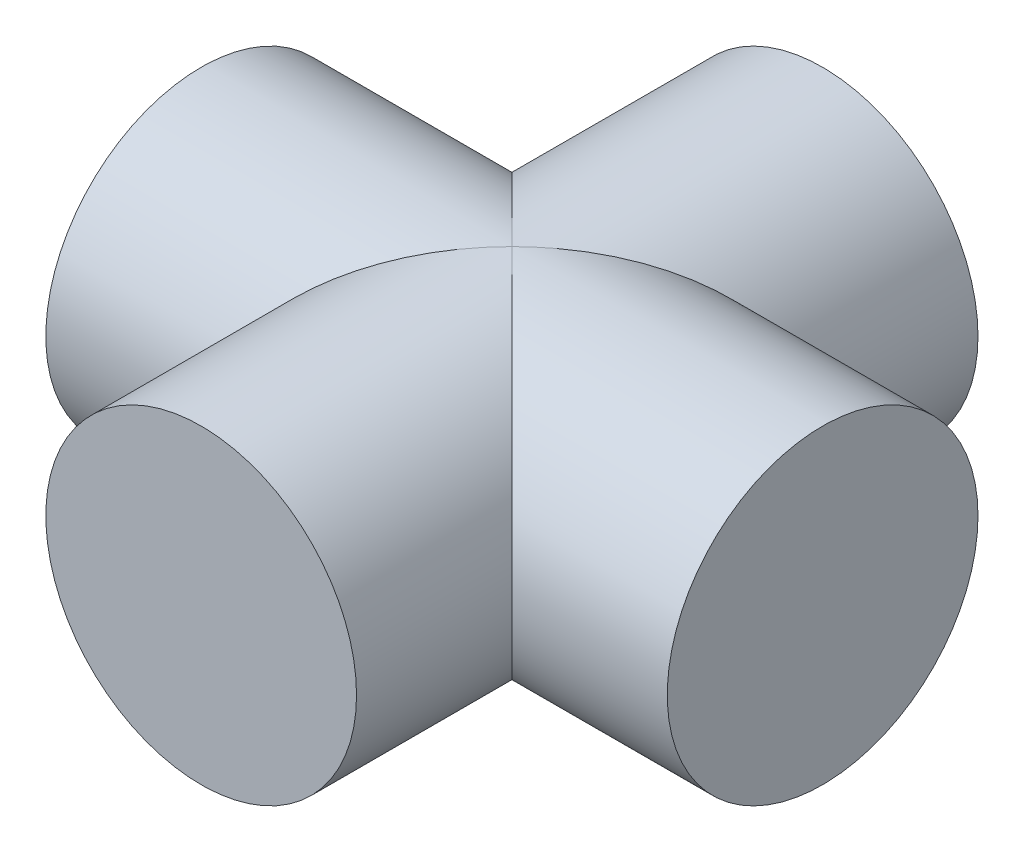
ISO-10303-21;
HEADER;
FILE_DESCRIPTION(('STEP AP214'),'2;1');
FILE_NAME('part.step','',(''),(''),'','','');
FILE_SCHEMA(('AUTOMOTIVE_DESIGN { 1 0 10303 214 1 1 1 1 }'));
ENDSEC;
DATA;
#1=APPLICATION_CONTEXT('core data for automotive mechanical design processes');
#2=APPLICATION_PROTOCOL_DEFINITION('international standard','automotive_design',2000,#1);
#3=PRODUCT_CONTEXT('',#1,'mechanical');
#4=PRODUCT('Part','Part','',(#3));
#5=PRODUCT_RELATED_PRODUCT_CATEGORY('part','',(#4));
#6=PRODUCT_DEFINITION_FORMATION('','',#4);
#7=PRODUCT_DEFINITION_CONTEXT('part definition',#1,'design');
#8=PRODUCT_DEFINITION('design','',#6,#7);
#9=PRODUCT_DEFINITION_SHAPE('','',#8);
#10=(LENGTH_UNIT() NAMED_UNIT(*) SI_UNIT(.MILLI.,.METRE.));
#11=(NAMED_UNIT(*) PLANE_ANGLE_UNIT() SI_UNIT($,.RADIAN.));
#12=(NAMED_UNIT(*) SI_UNIT($,.STERADIAN.) SOLID_ANGLE_UNIT());
#13=UNCERTAINTY_MEASURE_WITH_UNIT(LENGTH_MEASURE(1.E-05),#10,'distance_accuracy_value','');
#14=(GEOMETRIC_REPRESENTATION_CONTEXT(3) GLOBAL_UNCERTAINTY_ASSIGNED_CONTEXT((#13)) GLOBAL_UNIT_ASSIGNED_CONTEXT((#10,
#11,#12)) REPRESENTATION_CONTEXT('',''));
#15=CARTESIAN_POINT('',(0.,0.,0.));
#16=DIRECTION('',(0.,0.,1.));
#17=DIRECTION('',(1.,0.,0.));
#18=AXIS2_PLACEMENT_3D('',#15,#16,#17);
#19=CARTESIAN_POINT('',(0.,0.,-10.));
#20=DIRECTION('',(0.,0.,1.));
#21=DIRECTION('',(1.,0.,0.));
#22=AXIS2_PLACEMENT_3D('',#19,#20,#21);
#23=CYLINDRICAL_SURFACE('',#22,5.);
#24=CARTESIAN_POINT('',(0.,0.,0.));
#25=DIRECTION('',(0.707106781186547,0.,0.707106781186547));
#26=DIRECTION('',(-0.707106781186547,0.,0.707106781186547));
#27=AXIS2_PLACEMENT_3D('',#24,#25,#26);
#28=ELLIPSE('',#27,7.07106781186547,5.);
#29=CARTESIAN_POINT('',(0.,-5.,0.));
#30=VERTEX_POINT('',#29);
#31=CARTESIAN_POINT('',(0.,5.,0.));
#32=VERTEX_POINT('',#31);
#33=EDGE_CURVE('E42',#30,#32,#28,.T.);
#34=ORIENTED_EDGE('',*,*,#33,.F.);
#35=CARTESIAN_POINT('',(0.,0.,0.));
#36=DIRECTION('',(-0.707106781186547,0.,0.707106781186547));
#37=DIRECTION('',(0.707106781186547,0.,0.707106781186547));
#38=AXIS2_PLACEMENT_3D('',#35,#36,#37);
#39=ELLIPSE('',#38,7.07106781186547,5.);
#40=EDGE_CURVE('E54',#32,#30,#39,.T.);
#41=ORIENTED_EDGE('',*,*,#40,.F.);
#42=EDGE_LOOP('',(#34,#41));
#43=FACE_BOUND('',#42,.T.);
#44=CARTESIAN_POINT('',(0.,0.,-10.));
#45=DIRECTION('',(0.,0.,1.));
#46=DIRECTION('',(1.,0.,0.));
#47=AXIS2_PLACEMENT_3D('',#44,#45,#46);
#48=CIRCLE('',#47,5.);
#49=CARTESIAN_POINT('',(5.,0.,-10.));
#50=VERTEX_POINT('',#49);
#51=EDGE_CURVE('E61',#50,#50,#48,.T.);
#52=ORIENTED_EDGE('',*,*,#51,.T.);
#53=EDGE_LOOP('',(#52));
#54=FACE_BOUND('',#53,.T.);
#55=ADVANCED_FACE('F35',(#43,#54),#23,.T.);
#56=CARTESIAN_POINT('',(0.,0.,-10.));
#57=DIRECTION('',(0.,0.,1.));
#58=DIRECTION('',(1.,0.,0.));
#59=AXIS2_PLACEMENT_3D('',#56,#57,#58);
#60=PLANE('',#59);
#61=ORIENTED_EDGE('',*,*,#51,.F.);
#62=EDGE_LOOP('',(#61));
#63=FACE_BOUND('',#62,.T.);
#64=ADVANCED_FACE('F84',(#63),#60,.F.);
#65=CARTESIAN_POINT('',(10.,0.,0.));
#66=DIRECTION('',(1.,0.,0.));
#67=DIRECTION('',(0.,0.,-1.));
#68=AXIS2_PLACEMENT_3D('',#65,#66,#67);
#69=PLANE('',#68);
#70=CARTESIAN_POINT('',(10.,0.,0.));
#71=DIRECTION('',(1.,0.,0.));
#72=DIRECTION('',(0.,0.,-1.));
#73=AXIS2_PLACEMENT_3D('',#70,#71,#72);
#74=CIRCLE('',#73,5.);
#75=CARTESIAN_POINT('',(10.,0.,-5.));
#76=VERTEX_POINT('',#75);
#77=EDGE_CURVE('E74',#76,#76,#74,.T.);
#78=ORIENTED_EDGE('',*,*,#77,.T.);
#79=EDGE_LOOP('',(#78));
#80=FACE_BOUND('',#79,.T.);
#81=ADVANCED_FACE('F86',(#80),#69,.T.);
#82=CARTESIAN_POINT('',(-10.,0.,0.));
#83=DIRECTION('',(1.,0.,0.));
#84=DIRECTION('',(0.,0.,-1.));
#85=AXIS2_PLACEMENT_3D('',#82,#83,#84);
#86=CYLINDRICAL_SURFACE('',#85,5.);
#87=ORIENTED_EDGE('',*,*,#77,.F.);
#88=EDGE_LOOP('',(#87));
#89=FACE_BOUND('',#88,.T.);
#90=CARTESIAN_POINT('',(0.,0.,0.));
#91=DIRECTION('',(-0.707106781186547,0.,0.707106781186547));
#92=DIRECTION('',(0.707106781186547,0.,0.707106781186547));
#93=AXIS2_PLACEMENT_3D('',#90,#91,#92);
#94=ELLIPSE('',#93,7.07106781186547,5.);
#95=EDGE_CURVE('E48',#32,#30,#94,.F.);
#96=ORIENTED_EDGE('',*,*,#95,.T.);
#97=ORIENTED_EDGE('',*,*,#33,.T.);
#98=EDGE_LOOP('',(#96,#97));
#99=FACE_BOUND('',#98,.T.);
#100=ADVANCED_FACE('F63',(#89,#99),#86,.T.);
#101=CARTESIAN_POINT('',(0.,0.,10.));
#102=DIRECTION('',(0.,0.,1.));
#103=DIRECTION('',(1.,0.,0.));
#104=AXIS2_PLACEMENT_3D('',#101,#102,#103);
#105=PLANE('',#104);
#106=CARTESIAN_POINT('',(0.,0.,10.));
#107=DIRECTION('',(0.,0.,1.));
#108=DIRECTION('',(1.,0.,0.));
#109=AXIS2_PLACEMENT_3D('',#106,#107,#108);
#110=CIRCLE('',#109,5.);
#111=CARTESIAN_POINT('',(5.,0.,10.));
#112=VERTEX_POINT('',#111);
#113=EDGE_CURVE('E73',#112,#112,#110,.T.);
#114=ORIENTED_EDGE('',*,*,#113,.T.);
#115=EDGE_LOOP('',(#114));
#116=FACE_BOUND('',#115,.T.);
#117=ADVANCED_FACE('F94',(#116),#105,.T.);
#118=CARTESIAN_POINT('',(0.,0.,0.));
#119=DIRECTION('',(0.707106781186547,0.,0.707106781186547));
#120=DIRECTION('',(-0.707106781186547,0.,0.707106781186547));
#121=AXIS2_PLACEMENT_3D('',#118,#119,#120);
#122=ELLIPSE('',#121,7.07106781186547,5.);
#123=EDGE_CURVE('E11',#30,#32,#122,.F.);
#124=ORIENTED_EDGE('',*,*,#123,.F.);
#125=ORIENTED_EDGE('',*,*,#95,.F.);
#126=EDGE_LOOP('',(#124,#125));
#127=FACE_BOUND('',#126,.T.);
#128=ORIENTED_EDGE('',*,*,#113,.F.);
#129=EDGE_LOOP('',(#128));
#130=FACE_BOUND('',#129,.T.);
#131=ADVANCED_FACE('F59',(#127,#130),#23,.T.);
#132=ORIENTED_EDGE('',*,*,#40,.T.);
#133=ORIENTED_EDGE('',*,*,#123,.T.);
#134=EDGE_LOOP('',(#132,#133));
#135=FACE_BOUND('',#134,.T.);
#136=CARTESIAN_POINT('',(-10.,0.,0.));
#137=DIRECTION('',(1.,0.,0.));
#138=DIRECTION('',(0.,0.,-1.));
#139=AXIS2_PLACEMENT_3D('',#136,#137,#138);
#140=CIRCLE('',#139,5.);
#141=CARTESIAN_POINT('',(-10.,0.,-5.));
#142=VERTEX_POINT('',#141);
#143=EDGE_CURVE('E71',#142,#142,#140,.T.);
#144=ORIENTED_EDGE('',*,*,#143,.T.);
#145=EDGE_LOOP('',(#144));
#146=FACE_BOUND('',#145,.T.);
#147=ADVANCED_FACE('F64',(#135,#146),#86,.T.);
#148=CARTESIAN_POINT('',(-10.,0.,0.));
#149=DIRECTION('',(1.,0.,0.));
#150=DIRECTION('',(0.,0.,-1.));
#151=AXIS2_PLACEMENT_3D('',#148,#149,#150);
#152=PLANE('',#151);
#153=ORIENTED_EDGE('',*,*,#143,.F.);
#154=EDGE_LOOP('',(#153));
#155=FACE_BOUND('',#154,.T.);
#156=ADVANCED_FACE('F67',(#155),#152,.F.);
#157=CLOSED_SHELL('',(#55,#64,#81,#100,#117,#131,#147,#156));
#158=MANIFOLD_SOLID_BREP('B2',#157);
#159=ADVANCED_BREP_SHAPE_REPRESENTATION('',(#18,#158),#14);
#160=SHAPE_DEFINITION_REPRESENTATION(#9,#159);
ENDSEC;
END-ISO-10303-21;
